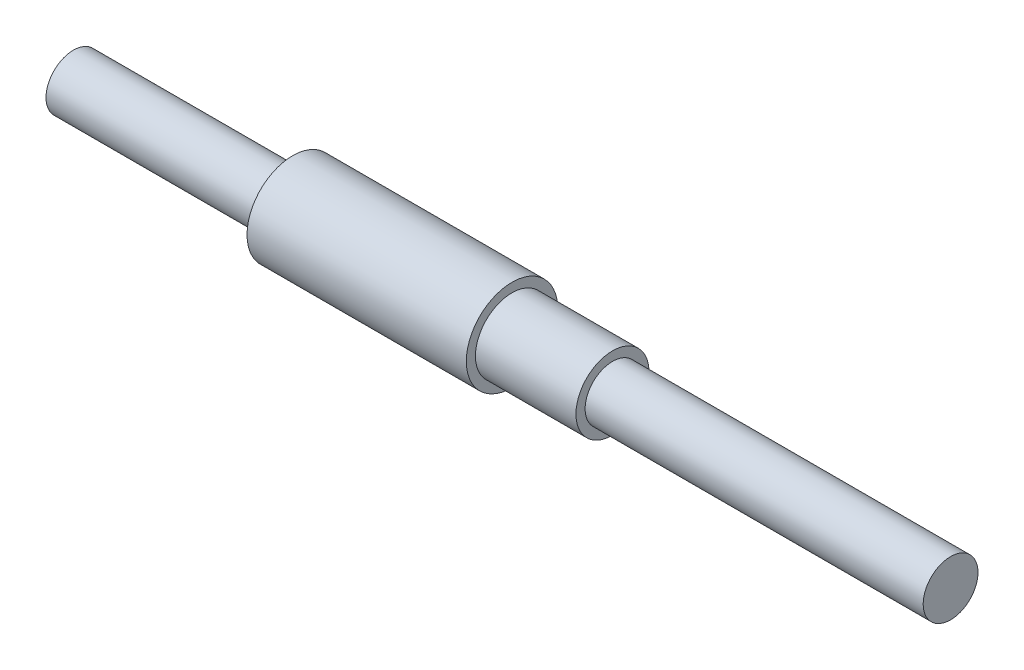
ISO-10303-21;
HEADER;
FILE_DESCRIPTION(('STEP AP214'),'2;1');
FILE_NAME('part.step','',(''),(''),'','','');
FILE_SCHEMA(('AUTOMOTIVE_DESIGN { 1 0 10303 214 1 1 1 1 }'));
ENDSEC;
DATA;
#1=APPLICATION_CONTEXT('core data for automotive mechanical design processes');
#2=APPLICATION_PROTOCOL_DEFINITION('international standard','automotive_design',2000,#1);
#3=PRODUCT_CONTEXT('',#1,'mechanical');
#4=PRODUCT('Part','Part','',(#3));
#5=PRODUCT_RELATED_PRODUCT_CATEGORY('part','',(#4));
#6=PRODUCT_DEFINITION_FORMATION('','',#4);
#7=PRODUCT_DEFINITION_CONTEXT('part definition',#1,'design');
#8=PRODUCT_DEFINITION('design','',#6,#7);
#9=PRODUCT_DEFINITION_SHAPE('','',#8);
#10=(LENGTH_UNIT() NAMED_UNIT(*) SI_UNIT(.MILLI.,.METRE.));
#11=(NAMED_UNIT(*) PLANE_ANGLE_UNIT() SI_UNIT($,.RADIAN.));
#12=(NAMED_UNIT(*) SI_UNIT($,.STERADIAN.) SOLID_ANGLE_UNIT());
#13=UNCERTAINTY_MEASURE_WITH_UNIT(LENGTH_MEASURE(1.E-05),#10,'distance_accuracy_value','');
#14=(GEOMETRIC_REPRESENTATION_CONTEXT(3) GLOBAL_UNCERTAINTY_ASSIGNED_CONTEXT((#13)) GLOBAL_UNIT_ASSIGNED_CONTEXT((#10,
#11,#12)) REPRESENTATION_CONTEXT('',''));
#15=CARTESIAN_POINT('',(0.,0.,0.));
#16=DIRECTION('',(0.,0.,1.));
#17=DIRECTION('',(1.,0.,0.));
#18=AXIS2_PLACEMENT_3D('',#15,#16,#17);
#19=CARTESIAN_POINT('',(24.,0.,0.));
#20=DIRECTION('',(-1.,0.,0.));
#21=DIRECTION('',(0.,0.,1.));
#22=AXIS2_PLACEMENT_3D('',#19,#20,#21);
#23=CYLINDRICAL_SURFACE('',#22,2.5);
#24=CARTESIAN_POINT('',(24.,0.,0.));
#25=DIRECTION('',(-1.,0.,0.));
#26=DIRECTION('',(0.,0.,1.));
#27=AXIS2_PLACEMENT_3D('',#24,#25,#26);
#28=CIRCLE('',#27,2.5);
#29=CARTESIAN_POINT('',(24.,0.,2.5));
#30=VERTEX_POINT('',#29);
#31=EDGE_CURVE('E49',#30,#30,#28,.T.);
#32=ORIENTED_EDGE('',*,*,#31,.T.);
#33=EDGE_LOOP('',(#32));
#34=FACE_BOUND('',#33,.T.);
#35=CARTESIAN_POINT('',(12.,0.,0.));
#36=DIRECTION('',(-1.,0.,0.));
#37=DIRECTION('',(0.,0.,1.));
#38=AXIS2_PLACEMENT_3D('',#35,#36,#37);
#39=CIRCLE('',#38,2.5);
#40=CARTESIAN_POINT('',(12.,0.,2.5));
#41=VERTEX_POINT('',#40);
#42=EDGE_CURVE('E51',#41,#41,#39,.T.);
#43=ORIENTED_EDGE('',*,*,#42,.F.);
#44=EDGE_LOOP('',(#43));
#45=FACE_BOUND('',#44,.T.);
#46=ADVANCED_FACE('F33',(#34,#45),#23,.T.);
#47=CARTESIAN_POINT('',(24.,0.,0.));
#48=DIRECTION('',(-1.,0.,0.));
#49=DIRECTION('',(0.,0.,1.));
#50=AXIS2_PLACEMENT_3D('',#47,#48,#49);
#51=PLANE('',#50);
#52=CARTESIAN_POINT('',(24.,0.,0.));
#53=DIRECTION('',(-1.,0.,0.));
#54=DIRECTION('',(0.,0.,1.));
#55=AXIS2_PLACEMENT_3D('',#52,#53,#54);
#56=CIRCLE('',#55,2.);
#57=CARTESIAN_POINT('',(24.,0.,2.));
#58=VERTEX_POINT('',#57);
#59=EDGE_CURVE('E60',#58,#58,#56,.T.);
#60=ORIENTED_EDGE('',*,*,#59,.T.);
#61=EDGE_LOOP('',(#60));
#62=FACE_BOUND('',#61,.T.);
#63=ORIENTED_EDGE('',*,*,#31,.F.);
#64=EDGE_LOOP('',(#63));
#65=FACE_BOUND('',#64,.T.);
#66=ADVANCED_FACE('F81',(#62,#65),#51,.F.);
#67=CARTESIAN_POINT('',(12.,0.,0.));
#68=DIRECTION('',(-1.,0.,0.));
#69=DIRECTION('',(0.,0.,1.));
#70=AXIS2_PLACEMENT_3D('',#67,#68,#69);
#71=PLANE('',#70);
#72=CARTESIAN_POINT('',(12.,0.,0.));
#73=DIRECTION('',(-1.,0.,0.));
#74=DIRECTION('',(0.,0.,1.));
#75=AXIS2_PLACEMENT_3D('',#72,#73,#74);
#76=CIRCLE('',#75,1.5);
#77=CARTESIAN_POINT('',(12.,0.,1.5));
#78=VERTEX_POINT('',#77);
#79=EDGE_CURVE('E54',#78,#78,#76,.T.);
#80=ORIENTED_EDGE('',*,*,#79,.F.);
#81=EDGE_LOOP('',(#80));
#82=FACE_BOUND('',#81,.T.);
#83=ORIENTED_EDGE('',*,*,#42,.T.);
#84=EDGE_LOOP('',(#83));
#85=FACE_BOUND('',#84,.T.);
#86=ADVANCED_FACE('F87',(#82,#85),#71,.T.);
#87=CARTESIAN_POINT('',(0.,0.,0.));
#88=DIRECTION('',(1.,0.,0.));
#89=DIRECTION('',(0.,0.,-1.));
#90=AXIS2_PLACEMENT_3D('',#87,#88,#89);
#91=PLANE('',#90);
#92=CARTESIAN_POINT('',(0.,0.,0.));
#93=DIRECTION('',(1.,0.,0.));
#94=DIRECTION('',(0.,0.,-1.));
#95=AXIS2_PLACEMENT_3D('',#92,#93,#94);
#96=CIRCLE('',#95,1.5);
#97=CARTESIAN_POINT('',(0.,0.,-1.5));
#98=VERTEX_POINT('',#97);
#99=EDGE_CURVE('E44',#98,#98,#96,.T.);
#100=ORIENTED_EDGE('',*,*,#99,.F.);
#101=EDGE_LOOP('',(#100));
#102=FACE_BOUND('',#101,.T.);
#103=ADVANCED_FACE('F92',(#102),#91,.F.);
#104=CARTESIAN_POINT('',(48.,0.,0.));
#105=DIRECTION('',(-1.,0.,0.));
#106=DIRECTION('',(0.,0.,1.));
#107=AXIS2_PLACEMENT_3D('',#104,#105,#106);
#108=CYLINDRICAL_SURFACE('',#107,1.5);
#109=ORIENTED_EDGE('',*,*,#79,.T.);
#110=EDGE_LOOP('',(#109));
#111=FACE_BOUND('',#110,.T.);
#112=ORIENTED_EDGE('',*,*,#99,.T.);
#113=EDGE_LOOP('',(#112));
#114=FACE_BOUND('',#113,.T.);
#115=ADVANCED_FACE('F35',(#111,#114),#108,.T.);
#116=CARTESIAN_POINT('',(29.5,0.,0.));
#117=DIRECTION('',(-1.,0.,0.));
#118=DIRECTION('',(0.,0.,1.));
#119=AXIS2_PLACEMENT_3D('',#116,#117,#118);
#120=CYLINDRICAL_SURFACE('',#119,2.);
#121=CARTESIAN_POINT('',(29.5,0.,0.));
#122=DIRECTION('',(-1.,0.,0.));
#123=DIRECTION('',(0.,0.,1.));
#124=AXIS2_PLACEMENT_3D('',#121,#122,#123);
#125=CIRCLE('',#124,2.);
#126=CARTESIAN_POINT('',(29.5,0.,2.));
#127=VERTEX_POINT('',#126);
#128=EDGE_CURVE('E59',#127,#127,#125,.T.);
#129=ORIENTED_EDGE('',*,*,#128,.T.);
#130=EDGE_LOOP('',(#129));
#131=FACE_BOUND('',#130,.T.);
#132=ORIENTED_EDGE('',*,*,#59,.F.);
#133=EDGE_LOOP('',(#132));
#134=FACE_BOUND('',#133,.T.);
#135=ADVANCED_FACE('F66',(#131,#134),#120,.T.);
#136=CARTESIAN_POINT('',(29.5,0.,0.));
#137=DIRECTION('',(-1.,0.,0.));
#138=DIRECTION('',(0.,0.,1.));
#139=AXIS2_PLACEMENT_3D('',#136,#137,#138);
#140=PLANE('',#139);
#141=CARTESIAN_POINT('',(29.5,0.,0.));
#142=DIRECTION('',(-1.,0.,0.));
#143=DIRECTION('',(0.,0.,1.));
#144=AXIS2_PLACEMENT_3D('',#141,#142,#143);
#145=CIRCLE('',#144,1.5);
#146=CARTESIAN_POINT('',(29.5,0.,1.5));
#147=VERTEX_POINT('',#146);
#148=EDGE_CURVE('E10',#147,#147,#145,.T.);
#149=ORIENTED_EDGE('',*,*,#148,.T.);
#150=EDGE_LOOP('',(#149));
#151=FACE_BOUND('',#150,.T.);
#152=ORIENTED_EDGE('',*,*,#128,.F.);
#153=EDGE_LOOP('',(#152));
#154=FACE_BOUND('',#153,.T.);
#155=ADVANCED_FACE('F69',(#151,#154),#140,.F.);
#156=CARTESIAN_POINT('',(48.,0.,0.));
#157=DIRECTION('',(1.,0.,0.));
#158=DIRECTION('',(0.,0.,-1.));
#159=AXIS2_PLACEMENT_3D('',#156,#157,#158);
#160=PLANE('',#159);
#161=CARTESIAN_POINT('',(48.,0.,0.));
#162=DIRECTION('',(1.,0.,0.));
#163=DIRECTION('',(0.,0.,-1.));
#164=AXIS2_PLACEMENT_3D('',#161,#162,#163);
#165=CIRCLE('',#164,1.5);
#166=CARTESIAN_POINT('',(48.,0.,-1.5));
#167=VERTEX_POINT('',#166);
#168=EDGE_CURVE('E40',#167,#167,#165,.T.);
#169=ORIENTED_EDGE('',*,*,#168,.T.);
#170=EDGE_LOOP('',(#169));
#171=FACE_BOUND('',#170,.T.);
#172=ADVANCED_FACE('F71',(#171),#160,.T.);
#173=ORIENTED_EDGE('',*,*,#168,.F.);
#174=EDGE_LOOP('',(#173));
#175=FACE_BOUND('',#174,.T.);
#176=ORIENTED_EDGE('',*,*,#148,.F.);
#177=EDGE_LOOP('',(#176));
#178=FACE_BOUND('',#177,.T.);
#179=ADVANCED_FACE('F77',(#175,#178),#108,.T.);
#180=CLOSED_SHELL('',(#46,#66,#86,#103,#115,#135,#155,#172,#179));
#181=MANIFOLD_SOLID_BREP('B2',#180);
#182=ADVANCED_BREP_SHAPE_REPRESENTATION('',(#18,#181),#14);
#183=SHAPE_DEFINITION_REPRESENTATION(#9,#182);
ENDSEC;
END-ISO-10303-21;
